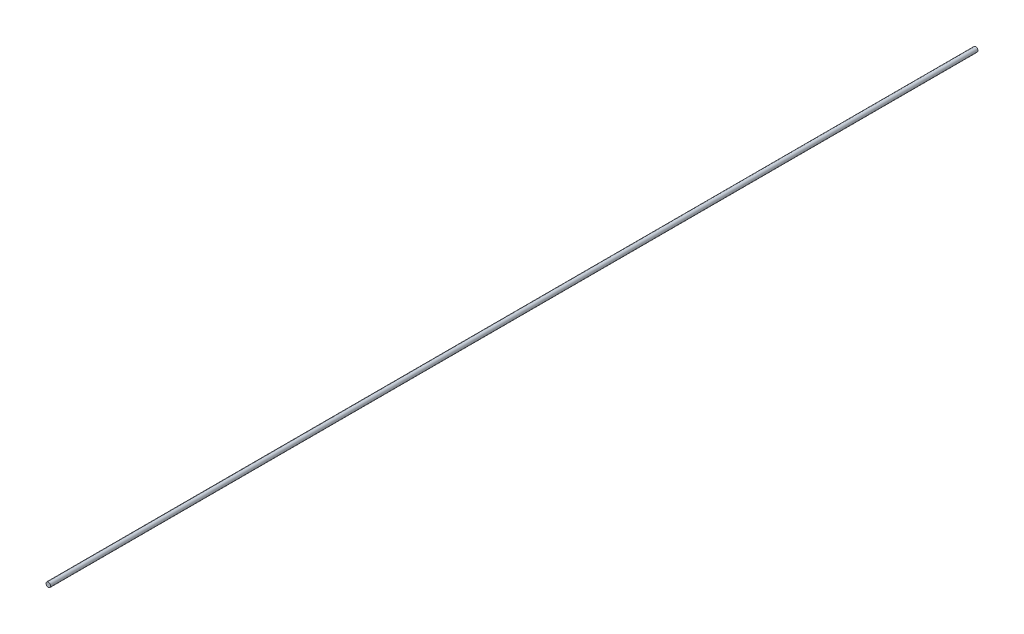
ISO-10303-21;
HEADER;
FILE_DESCRIPTION(('STEP AP214'),'2;1');
FILE_NAME('part.step','',(''),(''),'','','');
FILE_SCHEMA(('AUTOMOTIVE_DESIGN { 1 0 10303 214 1 1 1 1 }'));
ENDSEC;
DATA;
#1=APPLICATION_CONTEXT('core data for automotive mechanical design processes');
#2=APPLICATION_PROTOCOL_DEFINITION('international standard','automotive_design',2000,#1);
#3=PRODUCT_CONTEXT('',#1,'mechanical');
#4=PRODUCT('Part','Part','',(#3));
#5=PRODUCT_RELATED_PRODUCT_CATEGORY('part','',(#4));
#6=PRODUCT_DEFINITION_FORMATION('','',#4);
#7=PRODUCT_DEFINITION_CONTEXT('part definition',#1,'design');
#8=PRODUCT_DEFINITION('design','',#6,#7);
#9=PRODUCT_DEFINITION_SHAPE('','',#8);
#10=(LENGTH_UNIT() NAMED_UNIT(*) SI_UNIT(.MILLI.,.METRE.));
#11=(NAMED_UNIT(*) PLANE_ANGLE_UNIT() SI_UNIT($,.RADIAN.));
#12=(NAMED_UNIT(*) SI_UNIT($,.STERADIAN.) SOLID_ANGLE_UNIT());
#13=UNCERTAINTY_MEASURE_WITH_UNIT(LENGTH_MEASURE(1.E-05),#10,'distance_accuracy_value','');
#14=(GEOMETRIC_REPRESENTATION_CONTEXT(3) GLOBAL_UNCERTAINTY_ASSIGNED_CONTEXT((#13)) GLOBAL_UNIT_ASSIGNED_CONTEXT((#10,
#11,#12)) REPRESENTATION_CONTEXT('',''));
#15=CARTESIAN_POINT('',(0.,0.,0.));
#16=DIRECTION('',(0.,0.,1.));
#17=DIRECTION('',(1.,0.,0.));
#18=AXIS2_PLACEMENT_3D('',#15,#16,#17);
#19=CARTESIAN_POINT('',(0.,0.,100.));
#20=DIRECTION('',(0.,0.,-1.));
#21=DIRECTION('',(-1.,0.,0.));
#22=AXIS2_PLACEMENT_3D('',#19,#20,#21);
#23=CYLINDRICAL_SURFACE('',#22,0.25);
#24=CARTESIAN_POINT('',(0.,0.,100.));
#25=DIRECTION('',(0.,0.,1.));
#26=DIRECTION('',(1.,0.,0.));
#27=AXIS2_PLACEMENT_3D('',#24,#25,#26);
#28=CIRCLE('',#27,0.25);
#29=CARTESIAN_POINT('',(0.25,0.,100.));
#30=VERTEX_POINT('',#29);
#31=EDGE_CURVE('E10',#30,#30,#28,.T.);
#32=ORIENTED_EDGE('',*,*,#31,.F.);
#33=EDGE_LOOP('',(#32));
#34=FACE_BOUND('',#33,.T.);
#35=CARTESIAN_POINT('',(0.,0.,0.));
#36=DIRECTION('',(0.,0.,1.));
#37=DIRECTION('',(1.,0.,0.));
#38=AXIS2_PLACEMENT_3D('',#35,#36,#37);
#39=CIRCLE('',#38,0.25);
#40=CARTESIAN_POINT('',(0.25,0.,0.));
#41=VERTEX_POINT('',#40);
#42=EDGE_CURVE('E52',#41,#41,#39,.T.);
#43=ORIENTED_EDGE('',*,*,#42,.T.);
#44=EDGE_LOOP('',(#43));
#45=FACE_BOUND('',#44,.T.);
#46=ADVANCED_FACE('F49',(#34,#45),#23,.T.);
#47=CARTESIAN_POINT('',(0.,0.,100.));
#48=DIRECTION('',(0.,0.,1.));
#49=DIRECTION('',(1.,0.,0.));
#50=AXIS2_PLACEMENT_3D('',#47,#48,#49);
#51=PLANE('',#50);
#52=ORIENTED_EDGE('',*,*,#31,.T.);
#53=EDGE_LOOP('',(#52));
#54=FACE_BOUND('',#53,.T.);
#55=ADVANCED_FACE('F66',(#54),#51,.T.);
#56=CARTESIAN_POINT('',(0.,0.,0.));
#57=DIRECTION('',(0.,0.,1.));
#58=DIRECTION('',(1.,0.,0.));
#59=AXIS2_PLACEMENT_3D('',#56,#57,#58);
#60=PLANE('',#59);
#61=ORIENTED_EDGE('',*,*,#42,.F.);
#62=EDGE_LOOP('',(#61));
#63=FACE_BOUND('',#62,.T.);
#64=ADVANCED_FACE('F64',(#63),#60,.F.);
#65=CLOSED_SHELL('',(#46,#55,#64));
#66=MANIFOLD_SOLID_BREP('B2',#65);
#67=ADVANCED_BREP_SHAPE_REPRESENTATION('',(#18,#66),#14);
#68=SHAPE_DEFINITION_REPRESENTATION(#9,#67);
ENDSEC;
END-ISO-10303-21;
